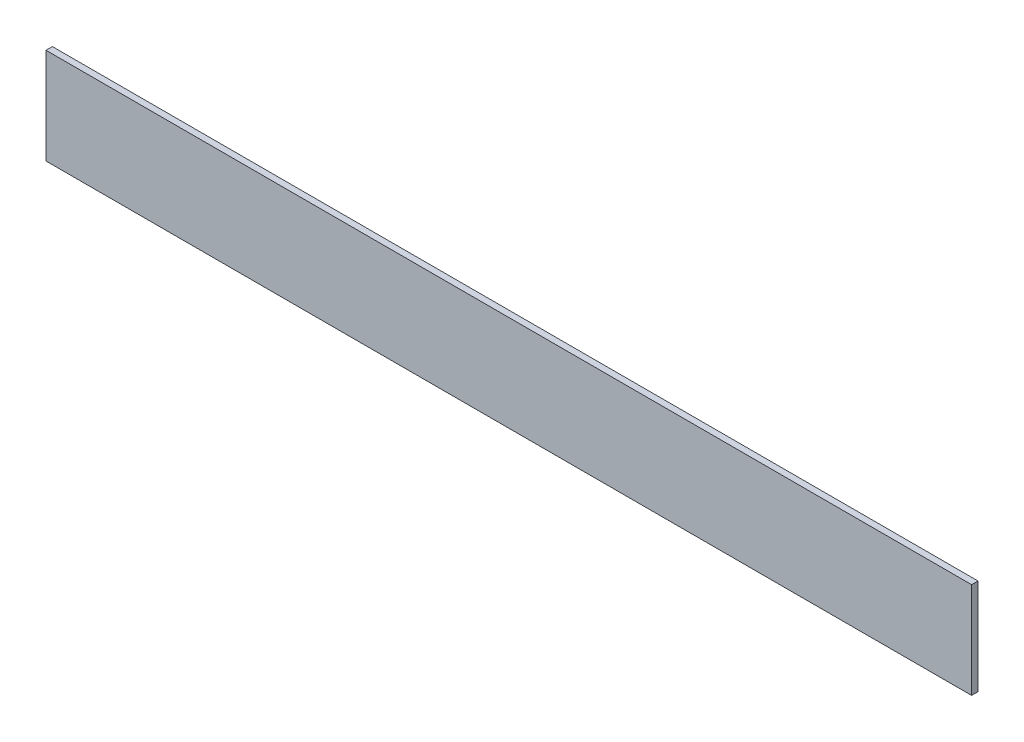
ISO-10303-21;
HEADER;
FILE_DESCRIPTION(('STEP AP214'),'2;1');
FILE_NAME('part.step','',(''),(''),'','','');
FILE_SCHEMA(('AUTOMOTIVE_DESIGN { 1 0 10303 214 1 1 1 1 }'));
ENDSEC;
DATA;
#1=APPLICATION_CONTEXT('core data for automotive mechanical design processes');
#2=APPLICATION_PROTOCOL_DEFINITION('international standard','automotive_design',2000,#1);
#3=PRODUCT_CONTEXT('',#1,'mechanical');
#4=PRODUCT('Part','Part','',(#3));
#5=PRODUCT_RELATED_PRODUCT_CATEGORY('part','',(#4));
#6=PRODUCT_DEFINITION_FORMATION('','',#4);
#7=PRODUCT_DEFINITION_CONTEXT('part definition',#1,'design');
#8=PRODUCT_DEFINITION('design','',#6,#7);
#9=PRODUCT_DEFINITION_SHAPE('','',#8);
#10=(LENGTH_UNIT() NAMED_UNIT(*) SI_UNIT(.MILLI.,.METRE.));
#11=(NAMED_UNIT(*) PLANE_ANGLE_UNIT() SI_UNIT($,.RADIAN.));
#12=(NAMED_UNIT(*) SI_UNIT($,.STERADIAN.) SOLID_ANGLE_UNIT());
#13=UNCERTAINTY_MEASURE_WITH_UNIT(LENGTH_MEASURE(1.E-05),#10,'distance_accuracy_value','');
#14=(GEOMETRIC_REPRESENTATION_CONTEXT(3) GLOBAL_UNCERTAINTY_ASSIGNED_CONTEXT((#13)) GLOBAL_UNIT_ASSIGNED_CONTEXT((#10,
#11,#12)) REPRESENTATION_CONTEXT('',''));
#15=CARTESIAN_POINT('',(0.,0.,0.));
#16=DIRECTION('',(0.,0.,1.));
#17=DIRECTION('',(1.,0.,0.));
#18=AXIS2_PLACEMENT_3D('',#15,#16,#17);
#19=CARTESIAN_POINT('',(229.745,23.8125,3.175));
#20=DIRECTION('',(-1.,0.,0.));
#21=DIRECTION('',(0.,0.,1.));
#22=AXIS2_PLACEMENT_3D('',#19,#20,#21);
#23=PLANE('',#22);
#24=DIRECTION('',(0.,1.,0.));
#25=VECTOR('',#24,1.);
#26=CARTESIAN_POINT('',(229.745,23.8125,0.));
#27=LINE('',#26,#25);
#28=CARTESIAN_POINT('',(229.745,-23.8125,0.));
#29=VERTEX_POINT('',#28);
#30=CARTESIAN_POINT('',(229.745,23.8125,0.));
#31=VERTEX_POINT('',#30);
#32=EDGE_CURVE('E102',#29,#31,#27,.T.);
#33=ORIENTED_EDGE('',*,*,#32,.T.);
#34=DIRECTION('',(0.,0.,-1.));
#35=VECTOR('',#34,1.);
#36=CARTESIAN_POINT('',(229.745,23.8125,3.175));
#37=LINE('',#36,#35);
#38=CARTESIAN_POINT('',(229.745,23.8125,3.175));
#39=VERTEX_POINT('',#38);
#40=EDGE_CURVE('E11',#39,#31,#37,.T.);
#41=ORIENTED_EDGE('',*,*,#40,.F.);
#42=DIRECTION('',(0.,1.,0.));
#43=VECTOR('',#42,1.);
#44=CARTESIAN_POINT('',(229.745,23.8125,3.175));
#45=LINE('',#44,#43);
#46=CARTESIAN_POINT('',(229.745,-23.8125,3.175));
#47=VERTEX_POINT('',#46);
#48=EDGE_CURVE('E90',#47,#39,#45,.T.);
#49=ORIENTED_EDGE('',*,*,#48,.F.);
#50=DIRECTION('',(0.,0.,-1.));
#51=VECTOR('',#50,1.);
#52=CARTESIAN_POINT('',(229.745,-23.8125,3.175));
#53=LINE('',#52,#51);
#54=EDGE_CURVE('E98',#47,#29,#53,.T.);
#55=ORIENTED_EDGE('',*,*,#54,.T.);
#56=EDGE_LOOP('',(#33,#41,#49,#55));
#57=FACE_BOUND('',#56,.T.);
#58=ADVANCED_FACE('F39',(#57),#23,.F.);
#59=CARTESIAN_POINT('',(-229.745,23.8125,3.175));
#60=DIRECTION('',(0.,-1.,0.));
#61=DIRECTION('',(0.,0.,-1.));
#62=AXIS2_PLACEMENT_3D('',#59,#60,#61);
#63=PLANE('',#62);
#64=DIRECTION('',(-1.,0.,0.));
#65=VECTOR('',#64,1.);
#66=CARTESIAN_POINT('',(-229.745,23.8125,0.));
#67=LINE('',#66,#65);
#68=CARTESIAN_POINT('',(-229.745,23.8125,0.));
#69=VERTEX_POINT('',#68);
#70=EDGE_CURVE('E94',#31,#69,#67,.T.);
#71=ORIENTED_EDGE('',*,*,#70,.T.);
#72=DIRECTION('',(0.,0.,-1.));
#73=VECTOR('',#72,1.);
#74=CARTESIAN_POINT('',(-229.745,23.8125,3.175));
#75=LINE('',#74,#73);
#76=CARTESIAN_POINT('',(-229.745,23.8125,3.175));
#77=VERTEX_POINT('',#76);
#78=EDGE_CURVE('E47',#77,#69,#75,.T.);
#79=ORIENTED_EDGE('',*,*,#78,.F.);
#80=DIRECTION('',(-1.,0.,0.));
#81=VECTOR('',#80,1.);
#82=CARTESIAN_POINT('',(-229.745,23.8125,3.175));
#83=LINE('',#82,#81);
#84=EDGE_CURVE('E85',#39,#77,#83,.T.);
#85=ORIENTED_EDGE('',*,*,#84,.F.);
#86=ORIENTED_EDGE('',*,*,#40,.T.);
#87=EDGE_LOOP('',(#71,#79,#85,#86));
#88=FACE_BOUND('',#87,.T.);
#89=ADVANCED_FACE('F93',(#88),#63,.F.);
#90=CARTESIAN_POINT('',(-229.745,23.8125,3.175));
#91=DIRECTION('',(1.,0.,0.));
#92=DIRECTION('',(0.,0.,-1.));
#93=AXIS2_PLACEMENT_3D('',#90,#91,#92);
#94=PLANE('',#93);
#95=DIRECTION('',(0.,-1.,0.));
#96=VECTOR('',#95,1.);
#97=CARTESIAN_POINT('',(-229.745,23.8125,0.));
#98=LINE('',#97,#96);
#99=CARTESIAN_POINT('',(-229.745,-23.8125,0.));
#100=VERTEX_POINT('',#99);
#101=EDGE_CURVE('E72',#69,#100,#98,.T.);
#102=ORIENTED_EDGE('',*,*,#101,.T.);
#103=DIRECTION('',(0.,0.,-1.));
#104=VECTOR('',#103,1.);
#105=CARTESIAN_POINT('',(-229.745,-23.8125,3.175));
#106=LINE('',#105,#104);
#107=CARTESIAN_POINT('',(-229.745,-23.8125,3.175));
#108=VERTEX_POINT('',#107);
#109=EDGE_CURVE('E95',#108,#100,#106,.T.);
#110=ORIENTED_EDGE('',*,*,#109,.F.);
#111=DIRECTION('',(0.,-1.,0.));
#112=VECTOR('',#111,1.);
#113=CARTESIAN_POINT('',(-229.745,23.8125,3.175));
#114=LINE('',#113,#112);
#115=EDGE_CURVE('E88',#77,#108,#114,.T.);
#116=ORIENTED_EDGE('',*,*,#115,.F.);
#117=ORIENTED_EDGE('',*,*,#78,.T.);
#118=EDGE_LOOP('',(#102,#110,#116,#117));
#119=FACE_BOUND('',#118,.T.);
#120=ADVANCED_FACE('F96',(#119),#94,.F.);
#121=CARTESIAN_POINT('',(-229.745,-23.8125,3.175));
#122=DIRECTION('',(0.,1.,0.));
#123=DIRECTION('',(0.,0.,1.));
#124=AXIS2_PLACEMENT_3D('',#121,#122,#123);
#125=PLANE('',#124);
#126=DIRECTION('',(1.,0.,0.));
#127=VECTOR('',#126,1.);
#128=CARTESIAN_POINT('',(-229.745,-23.8125,0.));
#129=LINE('',#128,#127);
#130=EDGE_CURVE('E78',#100,#29,#129,.T.);
#131=ORIENTED_EDGE('',*,*,#130,.T.);
#132=ORIENTED_EDGE('',*,*,#54,.F.);
#133=DIRECTION('',(1.,0.,0.));
#134=VECTOR('',#133,1.);
#135=CARTESIAN_POINT('',(-229.745,-23.8125,3.175));
#136=LINE('',#135,#134);
#137=EDGE_CURVE('E55',#108,#47,#136,.T.);
#138=ORIENTED_EDGE('',*,*,#137,.F.);
#139=ORIENTED_EDGE('',*,*,#109,.T.);
#140=EDGE_LOOP('',(#131,#132,#138,#139));
#141=FACE_BOUND('',#140,.T.);
#142=ADVANCED_FACE('F109',(#141),#125,.F.);
#143=CARTESIAN_POINT('',(0.,0.,3.175));
#144=DIRECTION('',(0.,0.,1.));
#145=DIRECTION('',(1.,0.,0.));
#146=AXIS2_PLACEMENT_3D('',#143,#144,#145);
#147=PLANE('',#146);
#148=ORIENTED_EDGE('',*,*,#48,.T.);
#149=ORIENTED_EDGE('',*,*,#84,.T.);
#150=ORIENTED_EDGE('',*,*,#115,.T.);
#151=ORIENTED_EDGE('',*,*,#137,.T.);
#152=EDGE_LOOP('',(#148,#149,#150,#151));
#153=FACE_BOUND('',#152,.T.);
#154=ADVANCED_FACE('F86',(#153),#147,.T.);
#155=CARTESIAN_POINT('',(0.,0.,0.));
#156=DIRECTION('',(0.,0.,1.));
#157=DIRECTION('',(1.,0.,0.));
#158=AXIS2_PLACEMENT_3D('',#155,#156,#157);
#159=PLANE('',#158);
#160=ORIENTED_EDGE('',*,*,#32,.F.);
#161=ORIENTED_EDGE('',*,*,#130,.F.);
#162=ORIENTED_EDGE('',*,*,#101,.F.);
#163=ORIENTED_EDGE('',*,*,#70,.F.);
#164=EDGE_LOOP('',(#160,#161,#162,#163));
#165=FACE_BOUND('',#164,.T.);
#166=ADVANCED_FACE('F112',(#165),#159,.F.);
#167=CLOSED_SHELL('',(#58,#89,#120,#142,#154,#166));
#168=MANIFOLD_SOLID_BREP('B2',#167);
#169=ADVANCED_BREP_SHAPE_REPRESENTATION('',(#18,#168),#14);
#170=SHAPE_DEFINITION_REPRESENTATION(#9,#169);
ENDSEC;
END-ISO-10303-21;
